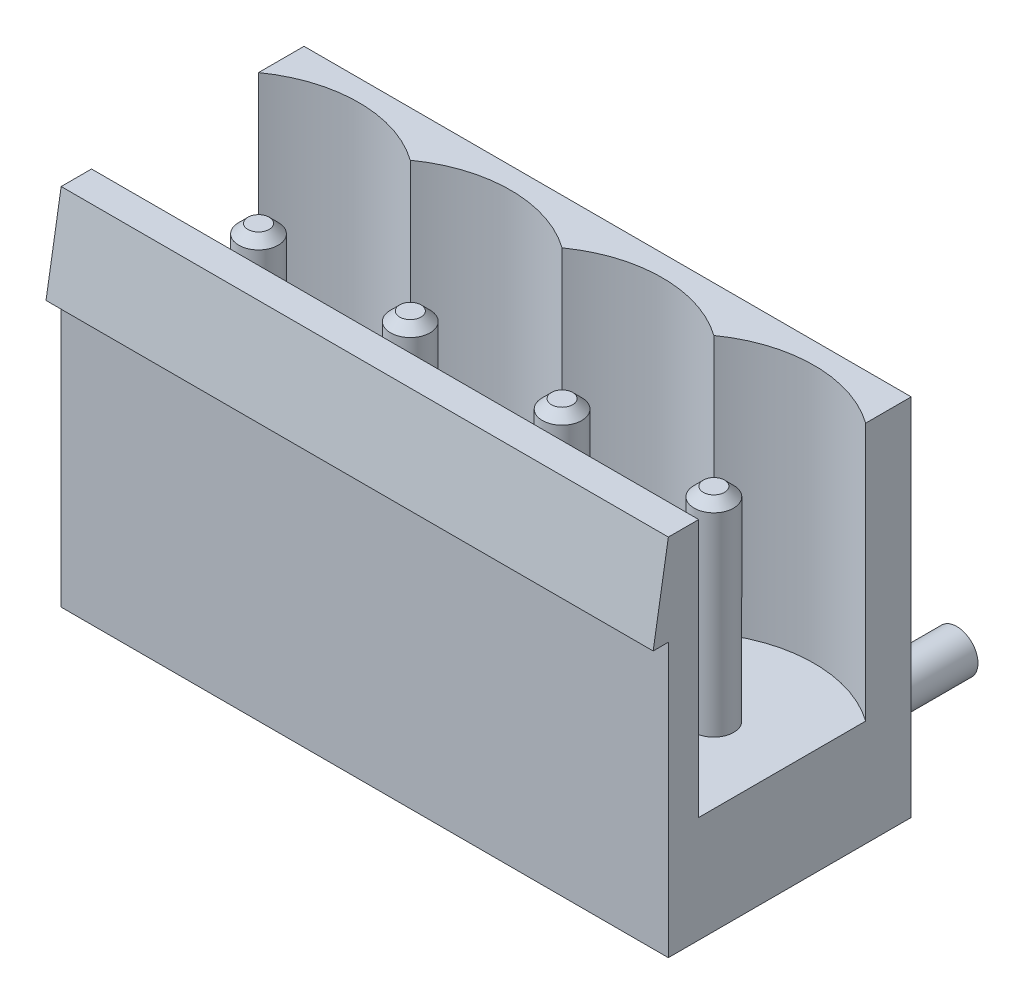
ISO-10303-21;
HEADER;
FILE_DESCRIPTION(('STEP AP214'),'2;1');
FILE_NAME('part.step','',(''),(''),'','','');
FILE_SCHEMA(('AUTOMOTIVE_DESIGN { 1 0 10303 214 1 1 1 1 }'));
ENDSEC;
DATA;
#1=APPLICATION_CONTEXT('core data for automotive mechanical design processes');
#2=APPLICATION_PROTOCOL_DEFINITION('international standard','automotive_design',2000,#1);
#3=PRODUCT_CONTEXT('',#1,'mechanical');
#4=PRODUCT('Part','Part','',(#3));
#5=PRODUCT_RELATED_PRODUCT_CATEGORY('part','',(#4));
#6=PRODUCT_DEFINITION_FORMATION('','',#4);
#7=PRODUCT_DEFINITION_CONTEXT('part definition',#1,'design');
#8=PRODUCT_DEFINITION('design','',#6,#7);
#9=PRODUCT_DEFINITION_SHAPE('','',#8);
#10=(LENGTH_UNIT() NAMED_UNIT(*) SI_UNIT(.MILLI.,.METRE.));
#11=(NAMED_UNIT(*) PLANE_ANGLE_UNIT() SI_UNIT($,.RADIAN.));
#12=(NAMED_UNIT(*) SI_UNIT($,.STERADIAN.) SOLID_ANGLE_UNIT());
#13=UNCERTAINTY_MEASURE_WITH_UNIT(LENGTH_MEASURE(1.E-05),#10,'distance_accuracy_value','');
#14=(GEOMETRIC_REPRESENTATION_CONTEXT(3) GLOBAL_UNCERTAINTY_ASSIGNED_CONTEXT((#13)) GLOBAL_UNIT_ASSIGNED_CONTEXT((#10,
#11,#12)) REPRESENTATION_CONTEXT('',''));
#15=CARTESIAN_POINT('',(0.,0.,0.));
#16=DIRECTION('',(0.,0.,1.));
#17=DIRECTION('',(1.,0.,0.));
#18=AXIS2_PLACEMENT_3D('',#15,#16,#17);
#19=CARTESIAN_POINT('',(20.,12.,0.));
#20=DIRECTION('',(0.,-1.,0.));
#21=DIRECTION('',(0.,0.,-1.));
#22=AXIS2_PLACEMENT_3D('',#19,#20,#21);
#23=PLANE('',#22);
#24=DIRECTION('',(-1.,0.,0.));
#25=VECTOR('',#24,1.);
#26=CARTESIAN_POINT('',(20.,12.,-8.));
#27=LINE('',#26,#25);
#28=CARTESIAN_POINT('',(20.,12.,-8.));
#29=VERTEX_POINT('',#28);
#30=CARTESIAN_POINT('',(0.,12.,-8.));
#31=VERTEX_POINT('',#30);
#32=EDGE_CURVE('E155',#29,#31,#27,.T.);
#33=ORIENTED_EDGE('',*,*,#32,.T.);
#34=DIRECTION('',(0.,0.,-1.));
#35=VECTOR('',#34,1.);
#36=CARTESIAN_POINT('',(0.,12.,-8.));
#37=LINE('',#36,#35);
#38=CARTESIAN_POINT('',(0.,12.,-6.5));
#39=VERTEX_POINT('',#38);
#40=EDGE_CURVE('E136',#39,#31,#37,.T.);
#41=ORIENTED_EDGE('',*,*,#40,.F.);
#42=CARTESIAN_POINT('',(2.5,12.,-2.99374999999999));
#43=DIRECTION('',(0.,1.,0.));
#44=DIRECTION('',(0.,0.,1.));
#45=AXIS2_PLACEMENT_3D('',#42,#43,#44);
#46=CIRCLE('',#45,4.30625000000001);
#47=CARTESIAN_POINT('',(5.,12.,-6.5));
#48=VERTEX_POINT('',#47);
#49=EDGE_CURVE('E213',#48,#39,#46,.T.);
#50=ORIENTED_EDGE('',*,*,#49,.F.);
#51=CARTESIAN_POINT('',(7.5,12.,-2.99374999999999));
#52=DIRECTION('',(0.,1.,0.));
#53=DIRECTION('',(0.,0.,1.));
#54=AXIS2_PLACEMENT_3D('',#51,#52,#53);
#55=CIRCLE('',#54,4.30625000000001);
#56=CARTESIAN_POINT('',(10.,12.,-6.5));
#57=VERTEX_POINT('',#56);
#58=EDGE_CURVE('E68',#57,#48,#55,.T.);
#59=ORIENTED_EDGE('',*,*,#58,.F.);
#60=CARTESIAN_POINT('',(12.5,12.,-2.99374999999999));
#61=DIRECTION('',(0.,1.,0.));
#62=DIRECTION('',(0.,0.,1.));
#63=AXIS2_PLACEMENT_3D('',#60,#61,#62);
#64=CIRCLE('',#63,4.30625000000001);
#65=CARTESIAN_POINT('',(15.,12.,-6.5));
#66=VERTEX_POINT('',#65);
#67=EDGE_CURVE('E219',#66,#57,#64,.T.);
#68=ORIENTED_EDGE('',*,*,#67,.F.);
#69=CARTESIAN_POINT('',(17.5,12.,-2.99374999999999));
#70=DIRECTION('',(0.,1.,0.));
#71=DIRECTION('',(0.,0.,1.));
#72=AXIS2_PLACEMENT_3D('',#69,#70,#71);
#73=CIRCLE('',#72,4.30625000000001);
#74=CARTESIAN_POINT('',(20.,12.,-6.5));
#75=VERTEX_POINT('',#74);
#76=EDGE_CURVE('E220',#75,#66,#73,.T.);
#77=ORIENTED_EDGE('',*,*,#76,.F.);
#78=DIRECTION('',(0.,0.,1.));
#79=VECTOR('',#78,1.);
#80=CARTESIAN_POINT('',(20.,12.,-8.));
#81=LINE('',#80,#79);
#82=EDGE_CURVE('E162',#29,#75,#81,.T.);
#83=ORIENTED_EDGE('',*,*,#82,.F.);
#84=EDGE_LOOP('',(#33,#41,#50,#59,#68,#77,#83));
#85=FACE_BOUND('',#84,.T.);
#86=ADVANCED_FACE('F32',(#85),#23,.F.);
#87=CARTESIAN_POINT('',(2.5,3.5,-2.99374999999999));
#88=DIRECTION('',(0.,1.,0.));
#89=DIRECTION('',(0.,0.,1.));
#90=AXIS2_PLACEMENT_3D('',#87,#88,#89);
#91=PLANE('',#90);
#92=CARTESIAN_POINT('',(12.5,3.5,-4.));
#93=DIRECTION('',(0.,1.,0.));
#94=DIRECTION('',(0.,0.,1.));
#95=AXIS2_PLACEMENT_3D('',#92,#93,#94);
#96=CIRCLE('',#95,0.65);
#97=CARTESIAN_POINT('',(12.5,3.5,-3.35));
#98=VERTEX_POINT('',#97);
#99=EDGE_CURVE('E276',#98,#98,#96,.T.);
#100=ORIENTED_EDGE('',*,*,#99,.F.);
#101=EDGE_LOOP('',(#100));
#102=FACE_BOUND('',#101,.T.);
#103=CARTESIAN_POINT('',(2.5,3.5,-4.));
#104=DIRECTION('',(0.,1.,0.));
#105=DIRECTION('',(0.,0.,1.));
#106=AXIS2_PLACEMENT_3D('',#103,#104,#105);
#107=CIRCLE('',#106,0.65);
#108=CARTESIAN_POINT('',(2.5,3.5,-3.35));
#109=VERTEX_POINT('',#108);
#110=EDGE_CURVE('E242',#109,#109,#107,.T.);
#111=ORIENTED_EDGE('',*,*,#110,.F.);
#112=EDGE_LOOP('',(#111));
#113=FACE_BOUND('',#112,.T.);
#114=CARTESIAN_POINT('',(2.5,3.5,-2.99374999999999));
#115=DIRECTION('',(0.,1.,0.));
#116=DIRECTION('',(0.,0.,1.));
#117=AXIS2_PLACEMENT_3D('',#114,#115,#116);
#118=CIRCLE('',#117,4.30625000000001);
#119=CARTESIAN_POINT('',(5.,3.5,-6.5));
#120=VERTEX_POINT('',#119);
#121=CARTESIAN_POINT('',(0.,3.5,-6.5));
#122=VERTEX_POINT('',#121);
#123=EDGE_CURVE('E212',#120,#122,#118,.T.);
#124=ORIENTED_EDGE('',*,*,#123,.T.);
#125=DIRECTION('',(0.,0.,1.));
#126=VECTOR('',#125,1.);
#127=CARTESIAN_POINT('',(0.,3.5,-6.5));
#128=LINE('',#127,#126);
#129=CARTESIAN_POINT('',(0.,3.5,-0.999999999999998));
#130=VERTEX_POINT('',#129);
#131=EDGE_CURVE('E247',#122,#130,#128,.T.);
#132=ORIENTED_EDGE('',*,*,#131,.T.);
#133=DIRECTION('',(1.,0.,0.));
#134=VECTOR('',#133,1.);
#135=CARTESIAN_POINT('',(0.,3.5,-0.999999999999998));
#136=LINE('',#135,#134);
#137=CARTESIAN_POINT('',(20.,3.5,-0.999999999999998));
#138=VERTEX_POINT('',#137);
#139=EDGE_CURVE('E250',#130,#138,#136,.T.);
#140=ORIENTED_EDGE('',*,*,#139,.T.);
#141=DIRECTION('',(0.,0.,-1.));
#142=VECTOR('',#141,1.);
#143=CARTESIAN_POINT('',(20.,3.5,-6.5));
#144=LINE('',#143,#142);
#145=CARTESIAN_POINT('',(20.,3.5,-6.5));
#146=VERTEX_POINT('',#145);
#147=EDGE_CURVE('E206',#138,#146,#144,.T.);
#148=ORIENTED_EDGE('',*,*,#147,.T.);
#149=CARTESIAN_POINT('',(17.5,3.5,-2.99374999999999));
#150=DIRECTION('',(0.,1.,0.));
#151=DIRECTION('',(0.,0.,1.));
#152=AXIS2_PLACEMENT_3D('',#149,#150,#151);
#153=CIRCLE('',#152,4.30625000000001);
#154=CARTESIAN_POINT('',(15.,3.5,-6.5));
#155=VERTEX_POINT('',#154);
#156=EDGE_CURVE('E273',#146,#155,#153,.T.);
#157=ORIENTED_EDGE('',*,*,#156,.T.);
#158=CARTESIAN_POINT('',(12.5,3.5,-2.99374999999999));
#159=DIRECTION('',(0.,1.,0.));
#160=DIRECTION('',(0.,0.,1.));
#161=AXIS2_PLACEMENT_3D('',#158,#159,#160);
#162=CIRCLE('',#161,4.30625000000001);
#163=CARTESIAN_POINT('',(10.,3.5,-6.5));
#164=VERTEX_POINT('',#163);
#165=EDGE_CURVE('E226',#155,#164,#162,.T.);
#166=ORIENTED_EDGE('',*,*,#165,.T.);
#167=CARTESIAN_POINT('',(7.5,3.5,-2.99374999999999));
#168=DIRECTION('',(0.,1.,0.));
#169=DIRECTION('',(0.,0.,1.));
#170=AXIS2_PLACEMENT_3D('',#167,#168,#169);
#171=CIRCLE('',#170,4.30625000000001);
#172=EDGE_CURVE('E231',#164,#120,#171,.T.);
#173=ORIENTED_EDGE('',*,*,#172,.T.);
#174=EDGE_LOOP('',(#124,#132,#140,#148,#157,#166,#173));
#175=FACE_BOUND('',#174,.T.);
#176=CARTESIAN_POINT('',(7.5,3.5,-4.));
#177=DIRECTION('',(0.,1.,0.));
#178=DIRECTION('',(0.,0.,1.));
#179=AXIS2_PLACEMENT_3D('',#176,#177,#178);
#180=CIRCLE('',#179,0.65);
#181=CARTESIAN_POINT('',(7.5,3.5,-3.35));
#182=VERTEX_POINT('',#181);
#183=EDGE_CURVE('E274',#182,#182,#180,.T.);
#184=ORIENTED_EDGE('',*,*,#183,.F.);
#185=EDGE_LOOP('',(#184));
#186=FACE_BOUND('',#185,.T.);
#187=CARTESIAN_POINT('',(17.5,3.5,-4.));
#188=DIRECTION('',(0.,1.,0.));
#189=DIRECTION('',(0.,0.,1.));
#190=AXIS2_PLACEMENT_3D('',#187,#188,#189);
#191=CIRCLE('',#190,0.65);
#192=CARTESIAN_POINT('',(17.5,3.5,-3.35));
#193=VERTEX_POINT('',#192);
#194=EDGE_CURVE('E281',#193,#193,#191,.T.);
#195=ORIENTED_EDGE('',*,*,#194,.F.);
#196=EDGE_LOOP('',(#195));
#197=FACE_BOUND('',#196,.T.);
#198=ADVANCED_FACE('F363',(#102,#113,#175,#186,#197),#91,.T.);
#199=CARTESIAN_POINT('',(20.,0.,0.));
#200=DIRECTION('',(0.,1.,0.));
#201=DIRECTION('',(0.,0.,1.));
#202=AXIS2_PLACEMENT_3D('',#199,#200,#201);
#203=PLANE('',#202);
#204=DIRECTION('',(-1.,0.,0.));
#205=VECTOR('',#204,1.);
#206=CARTESIAN_POINT('',(20.,0.,0.));
#207=LINE('',#206,#205);
#208=CARTESIAN_POINT('',(20.,0.,0.));
#209=VERTEX_POINT('',#208);
#210=CARTESIAN_POINT('',(0.,0.,0.));
#211=VERTEX_POINT('',#210);
#212=EDGE_CURVE('E309',#209,#211,#207,.T.);
#213=ORIENTED_EDGE('',*,*,#212,.T.);
#214=DIRECTION('',(0.,0.,1.));
#215=VECTOR('',#214,1.);
#216=CARTESIAN_POINT('',(0.,0.,-8.));
#217=LINE('',#216,#215);
#218=CARTESIAN_POINT('',(0.,0.,-8.));
#219=VERTEX_POINT('',#218);
#220=EDGE_CURVE('E308',#219,#211,#217,.T.);
#221=ORIENTED_EDGE('',*,*,#220,.F.);
#222=DIRECTION('',(-1.,0.,0.));
#223=VECTOR('',#222,1.);
#224=CARTESIAN_POINT('',(20.,0.,-8.));
#225=LINE('',#224,#223);
#226=CARTESIAN_POINT('',(20.,0.,-8.));
#227=VERTEX_POINT('',#226);
#228=EDGE_CURVE('E157',#227,#219,#225,.T.);
#229=ORIENTED_EDGE('',*,*,#228,.F.);
#230=DIRECTION('',(0.,0.,-1.));
#231=VECTOR('',#230,1.);
#232=CARTESIAN_POINT('',(20.,0.,-8.));
#233=LINE('',#232,#231);
#234=EDGE_CURVE('E290',#209,#227,#233,.T.);
#235=ORIENTED_EDGE('',*,*,#234,.F.);
#236=EDGE_LOOP('',(#213,#221,#229,#235));
#237=FACE_BOUND('',#236,.T.);
#238=ADVANCED_FACE('F306',(#237),#203,.F.);
#239=CARTESIAN_POINT('',(20.,0.,-8.));
#240=DIRECTION('',(0.,0.,1.));
#241=DIRECTION('',(0.,-1.,0.));
#242=AXIS2_PLACEMENT_3D('',#239,#240,#241);
#243=PLANE('',#242);
#244=CARTESIAN_POINT('',(7.5,1.5,-8.));
#245=DIRECTION('',(0.,0.,1.));
#246=DIRECTION('',(1.,0.,0.));
#247=AXIS2_PLACEMENT_3D('',#244,#245,#246);
#248=CIRCLE('',#247,0.7);
#249=CARTESIAN_POINT('',(8.2,1.5,-8.));
#250=VERTEX_POINT('',#249);
#251=EDGE_CURVE('E236',#250,#250,#248,.T.);
#252=ORIENTED_EDGE('',*,*,#251,.T.);
#253=EDGE_LOOP('',(#252));
#254=FACE_BOUND('',#253,.T.);
#255=CARTESIAN_POINT('',(2.5,1.5,-8.));
#256=DIRECTION('',(0.,0.,1.));
#257=DIRECTION('',(1.,0.,0.));
#258=AXIS2_PLACEMENT_3D('',#255,#256,#257);
#259=CIRCLE('',#258,0.7);
#260=CARTESIAN_POINT('',(3.2,1.5,-8.));
#261=VERTEX_POINT('',#260);
#262=EDGE_CURVE('E255',#261,#261,#259,.T.);
#263=ORIENTED_EDGE('',*,*,#262,.T.);
#264=EDGE_LOOP('',(#263));
#265=FACE_BOUND('',#264,.T.);
#266=ORIENTED_EDGE('',*,*,#228,.T.);
#267=DIRECTION('',(0.,1.,0.));
#268=VECTOR('',#267,1.);
#269=CARTESIAN_POINT('',(0.,-0.000999999999999265,-8.));
#270=LINE('',#269,#268);
#271=EDGE_CURVE('E139',#219,#31,#270,.T.);
#272=ORIENTED_EDGE('',*,*,#271,.T.);
#273=ORIENTED_EDGE('',*,*,#32,.F.);
#274=DIRECTION('',(0.,1.,0.));
#275=VECTOR('',#274,1.);
#276=CARTESIAN_POINT('',(20.,-0.000999999999999265,-8.));
#277=LINE('',#276,#275);
#278=EDGE_CURVE('E296',#227,#29,#277,.T.);
#279=ORIENTED_EDGE('',*,*,#278,.F.);
#280=EDGE_LOOP('',(#266,#272,#273,#279));
#281=FACE_BOUND('',#280,.T.);
#282=CARTESIAN_POINT('',(12.5,1.5,-8.));
#283=DIRECTION('',(0.,0.,1.));
#284=DIRECTION('',(1.,0.,0.));
#285=AXIS2_PLACEMENT_3D('',#282,#283,#284);
#286=CIRCLE('',#285,0.7);
#287=CARTESIAN_POINT('',(13.2,1.5,-8.));
#288=VERTEX_POINT('',#287);
#289=EDGE_CURVE('E177',#288,#288,#286,.T.);
#290=ORIENTED_EDGE('',*,*,#289,.T.);
#291=EDGE_LOOP('',(#290));
#292=FACE_BOUND('',#291,.T.);
#293=CARTESIAN_POINT('',(17.5,1.5,-8.));
#294=DIRECTION('',(0.,0.,1.));
#295=DIRECTION('',(1.,0.,0.));
#296=AXIS2_PLACEMENT_3D('',#293,#294,#295);
#297=CIRCLE('',#296,0.7);
#298=CARTESIAN_POINT('',(18.2,1.5,-8.));
#299=VERTEX_POINT('',#298);
#300=EDGE_CURVE('E183',#299,#299,#297,.T.);
#301=ORIENTED_EDGE('',*,*,#300,.T.);
#302=EDGE_LOOP('',(#301));
#303=FACE_BOUND('',#302,.T.);
#304=ADVANCED_FACE('F152',(#254,#265,#281,#292,#303),#243,.F.);
#305=DIRECTION('',(1.,0.,0.));
#306=VECTOR('',#305,1.);
#307=CARTESIAN_POINT('',(0.,12.,-0.999999999999998));
#308=LINE('',#307,#306);
#309=CARTESIAN_POINT('',(0.,12.,-0.999999999999998));
#310=VERTEX_POINT('',#309);
#311=CARTESIAN_POINT('',(20.,12.,-0.999999999999999));
#312=VERTEX_POINT('',#311);
#313=EDGE_CURVE('E209',#310,#312,#308,.T.);
#314=ORIENTED_EDGE('',*,*,#313,.F.);
#315=CARTESIAN_POINT('',(0.,12.,0.));
#316=VERTEX_POINT('',#315);
#317=EDGE_CURVE('E49',#316,#310,#37,.T.);
#318=ORIENTED_EDGE('',*,*,#317,.F.);
#319=DIRECTION('',(-1.,0.,0.));
#320=VECTOR('',#319,1.);
#321=CARTESIAN_POINT('',(20.,12.,0.));
#322=LINE('',#321,#320);
#323=CARTESIAN_POINT('',(20.,12.,0.));
#324=VERTEX_POINT('',#323);
#325=EDGE_CURVE('E163',#324,#316,#322,.T.);
#326=ORIENTED_EDGE('',*,*,#325,.F.);
#327=EDGE_CURVE('E287',#312,#324,#81,.T.);
#328=ORIENTED_EDGE('',*,*,#327,.F.);
#329=EDGE_LOOP('',(#314,#318,#326,#328));
#330=FACE_BOUND('',#329,.T.);
#331=ADVANCED_FACE('F329',(#330),#23,.F.);
#332=CARTESIAN_POINT('',(20.,9.,0.500000000000001));
#333=DIRECTION('',(0.,-0.164398987305357,-0.986393923832144));
#334=DIRECTION('',(0.,0.986393923832144,-0.164398987305357));
#335=AXIS2_PLACEMENT_3D('',#332,#333,#334);
#336=PLANE('',#335);
#337=ORIENTED_EDGE('',*,*,#325,.T.);
#338=DIRECTION('',(0.,0.986393923832144,-0.164398987305357));
#339=VECTOR('',#338,1.);
#340=CARTESIAN_POINT('',(0.,1.62064864864865,1.72989189189189));
#341=LINE('',#340,#339);
#342=CARTESIAN_POINT('',(0.,9.,0.500000000000001));
#343=VERTEX_POINT('',#342);
#344=EDGE_CURVE('E320',#343,#316,#341,.T.);
#345=ORIENTED_EDGE('',*,*,#344,.F.);
#346=DIRECTION('',(-1.,0.,0.));
#347=VECTOR('',#346,1.);
#348=CARTESIAN_POINT('',(20.,9.,0.500000000000001));
#349=LINE('',#348,#347);
#350=CARTESIAN_POINT('',(20.,9.,0.500000000000001));
#351=VERTEX_POINT('',#350);
#352=EDGE_CURVE('E168',#351,#343,#349,.T.);
#353=ORIENTED_EDGE('',*,*,#352,.F.);
#354=DIRECTION('',(0.,-0.986393923832144,0.164398987305357));
#355=VECTOR('',#354,1.);
#356=CARTESIAN_POINT('',(20.,1.62064864864865,1.72989189189189));
#357=LINE('',#356,#355);
#358=EDGE_CURVE('E311',#324,#351,#357,.T.);
#359=ORIENTED_EDGE('',*,*,#358,.F.);
#360=EDGE_LOOP('',(#337,#345,#353,#359));
#361=FACE_BOUND('',#360,.T.);
#362=ADVANCED_FACE('F332',(#361),#336,.F.);
#363=CARTESIAN_POINT('',(20.,9.,0.));
#364=DIRECTION('',(0.,1.,0.));
#365=DIRECTION('',(0.,0.,1.));
#366=AXIS2_PLACEMENT_3D('',#363,#364,#365);
#367=PLANE('',#366);
#368=ORIENTED_EDGE('',*,*,#352,.T.);
#369=DIRECTION('',(0.,0.,1.));
#370=VECTOR('',#369,1.);
#371=CARTESIAN_POINT('',(0.,9.,-8.));
#372=LINE('',#371,#370);
#373=CARTESIAN_POINT('',(0.,9.,0.));
#374=VERTEX_POINT('',#373);
#375=EDGE_CURVE('E147',#374,#343,#372,.T.);
#376=ORIENTED_EDGE('',*,*,#375,.F.);
#377=DIRECTION('',(-1.,0.,0.));
#378=VECTOR('',#377,1.);
#379=CARTESIAN_POINT('',(20.,9.,0.));
#380=LINE('',#379,#378);
#381=CARTESIAN_POINT('',(20.,9.,0.));
#382=VERTEX_POINT('',#381);
#383=EDGE_CURVE('E338',#382,#374,#380,.T.);
#384=ORIENTED_EDGE('',*,*,#383,.F.);
#385=DIRECTION('',(0.,0.,-1.));
#386=VECTOR('',#385,1.);
#387=CARTESIAN_POINT('',(20.,9.,-8.));
#388=LINE('',#387,#386);
#389=EDGE_CURVE('E286',#351,#382,#388,.T.);
#390=ORIENTED_EDGE('',*,*,#389,.F.);
#391=EDGE_LOOP('',(#368,#376,#384,#390));
#392=FACE_BOUND('',#391,.T.);
#393=ADVANCED_FACE('F336',(#392),#367,.F.);
#394=CARTESIAN_POINT('',(20.,0.,0.));
#395=DIRECTION('',(0.,0.,-1.));
#396=DIRECTION('',(0.,1.,0.));
#397=AXIS2_PLACEMENT_3D('',#394,#395,#396);
#398=PLANE('',#397);
#399=ORIENTED_EDGE('',*,*,#383,.T.);
#400=DIRECTION('',(0.,1.,0.));
#401=VECTOR('',#400,1.);
#402=CARTESIAN_POINT('',(0.,-0.00100000000000025,0.));
#403=LINE('',#402,#401);
#404=EDGE_CURVE('E158',#211,#374,#403,.T.);
#405=ORIENTED_EDGE('',*,*,#404,.F.);
#406=ORIENTED_EDGE('',*,*,#212,.F.);
#407=DIRECTION('',(0.,-1.,0.));
#408=VECTOR('',#407,1.);
#409=CARTESIAN_POINT('',(20.,-0.00100000000000025,0.));
#410=LINE('',#409,#408);
#411=EDGE_CURVE('E299',#382,#209,#410,.T.);
#412=ORIENTED_EDGE('',*,*,#411,.F.);
#413=EDGE_LOOP('',(#399,#405,#406,#412));
#414=FACE_BOUND('',#413,.T.);
#415=ADVANCED_FACE('F360',(#414),#398,.F.);
#416=CARTESIAN_POINT('',(2.5,1.5,-12.));
#417=DIRECTION('',(0.,0.,1.));
#418=DIRECTION('',(1.,0.,0.));
#419=AXIS2_PLACEMENT_3D('',#416,#417,#418);
#420=CYLINDRICAL_SURFACE('',#419,0.7);
#421=CARTESIAN_POINT('',(2.5,1.5,-12.));
#422=DIRECTION('',(0.,0.,1.));
#423=DIRECTION('',(1.,0.,0.));
#424=AXIS2_PLACEMENT_3D('',#421,#422,#423);
#425=CIRCLE('',#424,0.7);
#426=CARTESIAN_POINT('',(3.2,1.5,-12.));
#427=VERTEX_POINT('',#426);
#428=EDGE_CURVE('E259',#427,#427,#425,.T.);
#429=ORIENTED_EDGE('',*,*,#428,.T.);
#430=EDGE_LOOP('',(#429));
#431=FACE_BOUND('',#430,.T.);
#432=ORIENTED_EDGE('',*,*,#262,.F.);
#433=EDGE_LOOP('',(#432));
#434=FACE_BOUND('',#433,.T.);
#435=ADVANCED_FACE('F348',(#431,#434),#420,.T.);
#436=CARTESIAN_POINT('',(2.5,1.5,-12.));
#437=DIRECTION('',(0.,0.,1.));
#438=DIRECTION('',(1.,0.,0.));
#439=AXIS2_PLACEMENT_3D('',#436,#437,#438);
#440=PLANE('',#439);
#441=ORIENTED_EDGE('',*,*,#428,.F.);
#442=EDGE_LOOP('',(#441));
#443=FACE_BOUND('',#442,.T.);
#444=ADVANCED_FACE('F351',(#443),#440,.F.);
#445=CARTESIAN_POINT('',(2.5,3.5,-2.99374999999999));
#446=DIRECTION('',(0.,1.,0.));
#447=DIRECTION('',(0.,0.,1.));
#448=AXIS2_PLACEMENT_3D('',#445,#446,#447);
#449=CYLINDRICAL_SURFACE('',#448,4.30625000000001);
#450=ORIENTED_EDGE('',*,*,#49,.T.);
#451=DIRECTION('',(0.,1.,0.));
#452=VECTOR('',#451,1.);
#453=CARTESIAN_POINT('',(0.,3.5,-6.5));
#454=LINE('',#453,#452);
#455=EDGE_CURVE('E142',#122,#39,#454,.T.);
#456=ORIENTED_EDGE('',*,*,#455,.F.);
#457=ORIENTED_EDGE('',*,*,#123,.F.);
#458=DIRECTION('',(0.,1.,0.));
#459=VECTOR('',#458,1.);
#460=CARTESIAN_POINT('',(5.,3.5,-6.5));
#461=LINE('',#460,#459);
#462=EDGE_CURVE('E253',#120,#48,#461,.T.);
#463=ORIENTED_EDGE('',*,*,#462,.T.);
#464=EDGE_LOOP('',(#450,#456,#457,#463));
#465=FACE_BOUND('',#464,.T.);
#466=ADVANCED_FACE('F267',(#465),#449,.F.);
#467=CARTESIAN_POINT('',(0.,3.5,-0.999999999999998));
#468=DIRECTION('',(0.,0.,1.));
#469=DIRECTION('',(1.,0.,0.));
#470=AXIS2_PLACEMENT_3D('',#467,#468,#469);
#471=PLANE('',#470);
#472=ORIENTED_EDGE('',*,*,#313,.T.);
#473=DIRECTION('',(0.,1.,0.));
#474=VECTOR('',#473,1.);
#475=CARTESIAN_POINT('',(20.,3.5,-0.999999999999999));
#476=LINE('',#475,#474);
#477=EDGE_CURVE('E203',#138,#312,#476,.T.);
#478=ORIENTED_EDGE('',*,*,#477,.F.);
#479=ORIENTED_EDGE('',*,*,#139,.F.);
#480=DIRECTION('',(0.,1.,0.));
#481=VECTOR('',#480,1.);
#482=CARTESIAN_POINT('',(0.,3.5,-0.999999999999998));
#483=LINE('',#482,#481);
#484=EDGE_CURVE('E256',#130,#310,#483,.T.);
#485=ORIENTED_EDGE('',*,*,#484,.T.);
#486=EDGE_LOOP('',(#472,#478,#479,#485));
#487=FACE_BOUND('',#486,.T.);
#488=ADVANCED_FACE('F358',(#487),#471,.F.);
#489=CARTESIAN_POINT('',(2.5,13.838477631085,-4.));
#490=DIRECTION('',(0.,-1.,0.));
#491=DIRECTION('',(0.,0.,-1.));
#492=AXIS2_PLACEMENT_3D('',#489,#490,#491);
#493=CYLINDRICAL_SURFACE('',#492,0.65);
#494=CARTESIAN_POINT('',(2.5,9.90000000000001,-4.));
#495=DIRECTION('',(0.,-1.,0.));
#496=DIRECTION('',(0.,0.,-1.));
#497=AXIS2_PLACEMENT_3D('',#494,#495,#496);
#498=CIRCLE('',#497,0.65);
#499=CARTESIAN_POINT('',(2.5,9.90000000000001,-4.65));
#500=VERTEX_POINT('',#499);
#501=EDGE_CURVE('E165',#500,#500,#498,.T.);
#502=ORIENTED_EDGE('',*,*,#501,.T.);
#503=EDGE_LOOP('',(#502));
#504=FACE_BOUND('',#503,.T.);
#505=ORIENTED_EDGE('',*,*,#110,.T.);
#506=EDGE_LOOP('',(#505));
#507=FACE_BOUND('',#506,.T.);
#508=ADVANCED_FACE('F471',(#504,#507),#493,.T.);
#509=CARTESIAN_POINT('',(20.,10.2,0.));
#510=DIRECTION('',(0.,-1.,0.));
#511=DIRECTION('',(0.,0.,-1.));
#512=AXIS2_PLACEMENT_3D('',#509,#510,#511);
#513=PLANE('',#512);
#514=CARTESIAN_POINT('',(2.5,10.2,-4.));
#515=DIRECTION('',(0.,-1.,0.));
#516=DIRECTION('',(0.,0.,-1.));
#517=AXIS2_PLACEMENT_3D('',#514,#515,#516);
#518=CIRCLE('',#517,0.35);
#519=CARTESIAN_POINT('',(2.5,10.2,-4.35));
#520=VERTEX_POINT('',#519);
#521=EDGE_CURVE('E174',#520,#520,#518,.F.);
#522=ORIENTED_EDGE('',*,*,#521,.T.);
#523=EDGE_LOOP('',(#522));
#524=FACE_BOUND('',#523,.T.);
#525=ADVANCED_FACE('F387',(#524),#513,.F.);
#526=CARTESIAN_POINT('',(2.5,9.90000000000001,-4.));
#527=DIRECTION('',(0.,-1.,0.));
#528=DIRECTION('',(0.,0.,-1.));
#529=AXIS2_PLACEMENT_3D('',#526,#527,#528);
#530=CONICAL_SURFACE('',#529,0.65,0.785398163397458);
#531=ORIENTED_EDGE('',*,*,#521,.F.);
#532=EDGE_LOOP('',(#531));
#533=FACE_BOUND('',#532,.T.);
#534=ORIENTED_EDGE('',*,*,#501,.F.);
#535=EDGE_LOOP('',(#534));
#536=FACE_BOUND('',#535,.T.);
#537=ADVANCED_FACE('F383',(#533,#536),#530,.T.);
#538=CARTESIAN_POINT('',(7.5,1.5,-12.));
#539=DIRECTION('',(0.,0.,1.));
#540=DIRECTION('',(1.,0.,0.));
#541=AXIS2_PLACEMENT_3D('',#538,#539,#540);
#542=CYLINDRICAL_SURFACE('',#541,0.7);
#543=CARTESIAN_POINT('',(7.5,1.5,-12.));
#544=DIRECTION('',(0.,0.,1.));
#545=DIRECTION('',(1.,0.,0.));
#546=AXIS2_PLACEMENT_3D('',#543,#544,#545);
#547=CIRCLE('',#546,0.7);
#548=CARTESIAN_POINT('',(8.2,1.5,-12.));
#549=VERTEX_POINT('',#548);
#550=EDGE_CURVE('E239',#549,#549,#547,.T.);
#551=ORIENTED_EDGE('',*,*,#550,.T.);
#552=EDGE_LOOP('',(#551));
#553=FACE_BOUND('',#552,.T.);
#554=ORIENTED_EDGE('',*,*,#251,.F.);
#555=EDGE_LOOP('',(#554));
#556=FACE_BOUND('',#555,.T.);
#557=ADVANCED_FACE('F386',(#553,#556),#542,.T.);
#558=CARTESIAN_POINT('',(7.5,1.5,-12.));
#559=DIRECTION('',(0.,0.,1.));
#560=DIRECTION('',(1.,0.,0.));
#561=AXIS2_PLACEMENT_3D('',#558,#559,#560);
#562=PLANE('',#561);
#563=ORIENTED_EDGE('',*,*,#550,.F.);
#564=EDGE_LOOP('',(#563));
#565=FACE_BOUND('',#564,.T.);
#566=ADVANCED_FACE('F389',(#565),#562,.F.);
#567=CARTESIAN_POINT('',(12.5,1.5,-12.));
#568=DIRECTION('',(0.,0.,1.));
#569=DIRECTION('',(1.,0.,0.));
#570=AXIS2_PLACEMENT_3D('',#567,#568,#569);
#571=PLANE('',#570);
#572=CARTESIAN_POINT('',(12.5,1.5,-12.));
#573=DIRECTION('',(0.,0.,1.));
#574=DIRECTION('',(1.,0.,0.));
#575=AXIS2_PLACEMENT_3D('',#572,#573,#574);
#576=CIRCLE('',#575,0.7);
#577=CARTESIAN_POINT('',(13.2,1.5,-12.));
#578=VERTEX_POINT('',#577);
#579=EDGE_CURVE('E180',#578,#578,#576,.T.);
#580=ORIENTED_EDGE('',*,*,#579,.F.);
#581=EDGE_LOOP('',(#580));
#582=FACE_BOUND('',#581,.T.);
#583=ADVANCED_FACE('F394',(#582),#571,.F.);
#584=CARTESIAN_POINT('',(12.5,1.5,-12.));
#585=DIRECTION('',(0.,0.,1.));
#586=DIRECTION('',(1.,0.,0.));
#587=AXIS2_PLACEMENT_3D('',#584,#585,#586);
#588=CYLINDRICAL_SURFACE('',#587,0.7);
#589=ORIENTED_EDGE('',*,*,#579,.T.);
#590=EDGE_LOOP('',(#589));
#591=FACE_BOUND('',#590,.T.);
#592=ORIENTED_EDGE('',*,*,#289,.F.);
#593=EDGE_LOOP('',(#592));
#594=FACE_BOUND('',#593,.T.);
#595=ADVANCED_FACE('F390',(#591,#594),#588,.T.);
#596=CARTESIAN_POINT('',(17.5,1.5,-12.));
#597=DIRECTION('',(0.,0.,1.));
#598=DIRECTION('',(1.,0.,0.));
#599=AXIS2_PLACEMENT_3D('',#596,#597,#598);
#600=PLANE('',#599);
#601=CARTESIAN_POINT('',(17.5,1.5,-12.));
#602=DIRECTION('',(0.,0.,1.));
#603=DIRECTION('',(1.,0.,0.));
#604=AXIS2_PLACEMENT_3D('',#601,#602,#603);
#605=CIRCLE('',#604,0.7);
#606=CARTESIAN_POINT('',(18.2,1.5,-12.));
#607=VERTEX_POINT('',#606);
#608=EDGE_CURVE('E186',#607,#607,#605,.T.);
#609=ORIENTED_EDGE('',*,*,#608,.F.);
#610=EDGE_LOOP('',(#609));
#611=FACE_BOUND('',#610,.T.);
#612=ADVANCED_FACE('F393',(#611),#600,.F.);
#613=CARTESIAN_POINT('',(17.5,1.5,-12.));
#614=DIRECTION('',(0.,0.,1.));
#615=DIRECTION('',(1.,0.,0.));
#616=AXIS2_PLACEMENT_3D('',#613,#614,#615);
#617=CYLINDRICAL_SURFACE('',#616,0.7);
#618=ORIENTED_EDGE('',*,*,#608,.T.);
#619=EDGE_LOOP('',(#618));
#620=FACE_BOUND('',#619,.T.);
#621=ORIENTED_EDGE('',*,*,#300,.F.);
#622=EDGE_LOOP('',(#621));
#623=FACE_BOUND('',#622,.T.);
#624=ADVANCED_FACE('F399',(#620,#623),#617,.T.);
#625=CARTESIAN_POINT('',(7.5,3.5,-2.99374999999999));
#626=DIRECTION('',(0.,1.,0.));
#627=DIRECTION('',(0.,0.,1.));
#628=AXIS2_PLACEMENT_3D('',#625,#626,#627);
#629=CYLINDRICAL_SURFACE('',#628,4.30625000000001);
#630=ORIENTED_EDGE('',*,*,#58,.T.);
#631=ORIENTED_EDGE('',*,*,#462,.F.);
#632=ORIENTED_EDGE('',*,*,#172,.F.);
#633=DIRECTION('',(0.,1.,0.));
#634=VECTOR('',#633,1.);
#635=CARTESIAN_POINT('',(10.,3.5,-6.5));
#636=LINE('',#635,#634);
#637=EDGE_CURVE('E58',#164,#57,#636,.T.);
#638=ORIENTED_EDGE('',*,*,#637,.T.);
#639=EDGE_LOOP('',(#630,#631,#632,#638));
#640=FACE_BOUND('',#639,.T.);
#641=ADVANCED_FACE('F402',(#640),#629,.F.);
#642=CARTESIAN_POINT('',(12.5,3.5,-2.99374999999999));
#643=DIRECTION('',(0.,1.,0.));
#644=DIRECTION('',(0.,0.,1.));
#645=AXIS2_PLACEMENT_3D('',#642,#643,#644);
#646=CYLINDRICAL_SURFACE('',#645,4.30625000000001);
#647=ORIENTED_EDGE('',*,*,#67,.T.);
#648=ORIENTED_EDGE('',*,*,#637,.F.);
#649=ORIENTED_EDGE('',*,*,#165,.F.);
#650=DIRECTION('',(0.,1.,0.));
#651=VECTOR('',#650,1.);
#652=CARTESIAN_POINT('',(15.,3.5,-6.5));
#653=LINE('',#652,#651);
#654=EDGE_CURVE('E77',#155,#66,#653,.T.);
#655=ORIENTED_EDGE('',*,*,#654,.T.);
#656=EDGE_LOOP('',(#647,#648,#649,#655));
#657=FACE_BOUND('',#656,.T.);
#658=ADVANCED_FACE('F270',(#657),#646,.F.);
#659=CARTESIAN_POINT('',(17.5,3.5,-2.99374999999999));
#660=DIRECTION('',(0.,1.,0.));
#661=DIRECTION('',(0.,0.,1.));
#662=AXIS2_PLACEMENT_3D('',#659,#660,#661);
#663=CYLINDRICAL_SURFACE('',#662,4.30625000000001);
#664=ORIENTED_EDGE('',*,*,#76,.T.);
#665=ORIENTED_EDGE('',*,*,#654,.F.);
#666=ORIENTED_EDGE('',*,*,#156,.F.);
#667=DIRECTION('',(0.,1.,0.));
#668=VECTOR('',#667,1.);
#669=CARTESIAN_POINT('',(20.,3.5,-6.5));
#670=LINE('',#669,#668);
#671=EDGE_CURVE('E205',#146,#75,#670,.T.);
#672=ORIENTED_EDGE('',*,*,#671,.T.);
#673=EDGE_LOOP('',(#664,#665,#666,#672));
#674=FACE_BOUND('',#673,.T.);
#675=ADVANCED_FACE('F272',(#674),#663,.F.);
#676=CARTESIAN_POINT('',(7.5,13.838477631085,-4.));
#677=DIRECTION('',(0.,-1.,0.));
#678=DIRECTION('',(0.,0.,-1.));
#679=AXIS2_PLACEMENT_3D('',#676,#677,#678);
#680=CYLINDRICAL_SURFACE('',#679,0.65);
#681=CARTESIAN_POINT('',(7.5,9.90000000000001,-4.));
#682=DIRECTION('',(0.,-1.,0.));
#683=DIRECTION('',(0.,0.,-1.));
#684=AXIS2_PLACEMENT_3D('',#681,#682,#683);
#685=CIRCLE('',#684,0.65);
#686=CARTESIAN_POINT('',(7.5,9.90000000000001,-4.65));
#687=VERTEX_POINT('',#686);
#688=EDGE_CURVE('E189',#687,#687,#685,.T.);
#689=ORIENTED_EDGE('',*,*,#688,.T.);
#690=EDGE_LOOP('',(#689));
#691=FACE_BOUND('',#690,.T.);
#692=ORIENTED_EDGE('',*,*,#183,.T.);
#693=EDGE_LOOP('',(#692));
#694=FACE_BOUND('',#693,.T.);
#695=ADVANCED_FACE('F452',(#691,#694),#680,.T.);
#696=CARTESIAN_POINT('',(20.,10.2,0.));
#697=DIRECTION('',(0.,-1.,0.));
#698=DIRECTION('',(0.,0.,-1.));
#699=AXIS2_PLACEMENT_3D('',#696,#697,#698);
#700=PLANE('',#699);
#701=CARTESIAN_POINT('',(7.5,10.2,-4.));
#702=DIRECTION('',(0.,-1.,0.));
#703=DIRECTION('',(0.,0.,-1.));
#704=AXIS2_PLACEMENT_3D('',#701,#702,#703);
#705=CIRCLE('',#704,0.35);
#706=CARTESIAN_POINT('',(7.5,10.2,-4.35));
#707=VERTEX_POINT('',#706);
#708=EDGE_CURVE('E192',#707,#707,#705,.F.);
#709=ORIENTED_EDGE('',*,*,#708,.T.);
#710=EDGE_LOOP('',(#709));
#711=FACE_BOUND('',#710,.T.);
#712=ADVANCED_FACE('F426',(#711),#700,.F.);
#713=CARTESIAN_POINT('',(12.5,13.838477631085,-4.));
#714=DIRECTION('',(0.,-1.,0.));
#715=DIRECTION('',(0.,0.,-1.));
#716=AXIS2_PLACEMENT_3D('',#713,#714,#715);
#717=CYLINDRICAL_SURFACE('',#716,0.65);
#718=CARTESIAN_POINT('',(12.5,9.90000000000001,-4.));
#719=DIRECTION('',(0.,-1.,0.));
#720=DIRECTION('',(0.,0.,-1.));
#721=AXIS2_PLACEMENT_3D('',#718,#719,#720);
#722=CIRCLE('',#721,0.65);
#723=CARTESIAN_POINT('',(12.5,9.90000000000001,-4.65));
#724=VERTEX_POINT('',#723);
#725=EDGE_CURVE('E195',#724,#724,#722,.T.);
#726=ORIENTED_EDGE('',*,*,#725,.T.);
#727=EDGE_LOOP('',(#726));
#728=FACE_BOUND('',#727,.T.);
#729=ORIENTED_EDGE('',*,*,#99,.T.);
#730=EDGE_LOOP('',(#729));
#731=FACE_BOUND('',#730,.T.);
#732=ADVANCED_FACE('F422',(#728,#731),#717,.T.);
#733=CARTESIAN_POINT('',(20.,10.2,0.));
#734=DIRECTION('',(0.,-1.,0.));
#735=DIRECTION('',(0.,0.,-1.));
#736=AXIS2_PLACEMENT_3D('',#733,#734,#735);
#737=PLANE('',#736);
#738=CARTESIAN_POINT('',(12.5,10.2,-4.));
#739=DIRECTION('',(0.,-1.,0.));
#740=DIRECTION('',(0.,0.,-1.));
#741=AXIS2_PLACEMENT_3D('',#738,#739,#740);
#742=CIRCLE('',#741,0.350000000000003);
#743=CARTESIAN_POINT('',(12.5,10.2,-4.35));
#744=VERTEX_POINT('',#743);
#745=EDGE_CURVE('E198',#744,#744,#742,.F.);
#746=ORIENTED_EDGE('',*,*,#745,.T.);
#747=EDGE_LOOP('',(#746));
#748=FACE_BOUND('',#747,.T.);
#749=ADVANCED_FACE('F425',(#748),#737,.F.);
#750=CARTESIAN_POINT('',(17.5,13.838477631085,-4.));
#751=DIRECTION('',(0.,-1.,0.));
#752=DIRECTION('',(0.,0.,-1.));
#753=AXIS2_PLACEMENT_3D('',#750,#751,#752);
#754=CYLINDRICAL_SURFACE('',#753,0.65);
#755=CARTESIAN_POINT('',(17.5,9.9,-4.));
#756=DIRECTION('',(0.,-1.,0.));
#757=DIRECTION('',(0.,0.,-1.));
#758=AXIS2_PLACEMENT_3D('',#755,#756,#757);
#759=CIRCLE('',#758,0.65);
#760=CARTESIAN_POINT('',(17.5,9.9,-4.65));
#761=VERTEX_POINT('',#760);
#762=EDGE_CURVE('E41',#761,#761,#759,.T.);
#763=ORIENTED_EDGE('',*,*,#762,.T.);
#764=EDGE_LOOP('',(#763));
#765=FACE_BOUND('',#764,.T.);
#766=ORIENTED_EDGE('',*,*,#194,.T.);
#767=EDGE_LOOP('',(#766));
#768=FACE_BOUND('',#767,.T.);
#769=ADVANCED_FACE('F436',(#765,#768),#754,.T.);
#770=CARTESIAN_POINT('',(20.,10.2,0.));
#771=DIRECTION('',(0.,-1.,0.));
#772=DIRECTION('',(0.,0.,-1.));
#773=AXIS2_PLACEMENT_3D('',#770,#771,#772);
#774=PLANE('',#773);
#775=CARTESIAN_POINT('',(17.5,10.2,-4.));
#776=DIRECTION('',(0.,-1.,0.));
#777=DIRECTION('',(0.,0.,-1.));
#778=AXIS2_PLACEMENT_3D('',#775,#776,#777);
#779=CIRCLE('',#778,0.349999999999996);
#780=CARTESIAN_POINT('',(17.5,10.2,-4.34999999999999));
#781=VERTEX_POINT('',#780);
#782=EDGE_CURVE('E12',#781,#781,#779,.F.);
#783=ORIENTED_EDGE('',*,*,#782,.T.);
#784=EDGE_LOOP('',(#783));
#785=FACE_BOUND('',#784,.T.);
#786=ADVANCED_FACE('F410',(#785),#774,.F.);
#787=CARTESIAN_POINT('',(7.5,9.90000000000001,-4.));
#788=DIRECTION('',(0.,-1.,0.));
#789=DIRECTION('',(0.,0.,-1.));
#790=AXIS2_PLACEMENT_3D('',#787,#788,#789);
#791=CONICAL_SURFACE('',#790,0.65,0.785398163397458);
#792=ORIENTED_EDGE('',*,*,#708,.F.);
#793=EDGE_LOOP('',(#792));
#794=FACE_BOUND('',#793,.T.);
#795=ORIENTED_EDGE('',*,*,#688,.F.);
#796=EDGE_LOOP('',(#795));
#797=FACE_BOUND('',#796,.T.);
#798=ADVANCED_FACE('F407',(#794,#797),#791,.T.);
#799=CARTESIAN_POINT('',(12.5,9.90000000000001,-4.));
#800=DIRECTION('',(0.,-1.,0.));
#801=DIRECTION('',(0.,0.,-1.));
#802=AXIS2_PLACEMENT_3D('',#799,#800,#801);
#803=CONICAL_SURFACE('',#802,0.65,0.785398163397452);
#804=ORIENTED_EDGE('',*,*,#745,.F.);
#805=EDGE_LOOP('',(#804));
#806=FACE_BOUND('',#805,.T.);
#807=ORIENTED_EDGE('',*,*,#725,.F.);
#808=EDGE_LOOP('',(#807));
#809=FACE_BOUND('',#808,.T.);
#810=ADVANCED_FACE('F409',(#806,#809),#803,.T.);
#811=CARTESIAN_POINT('',(17.5,9.9,-4.));
#812=DIRECTION('',(0.,-1.,0.));
#813=DIRECTION('',(0.,0.,-1.));
#814=AXIS2_PLACEMENT_3D('',#811,#812,#813);
#815=CONICAL_SURFACE('',#814,0.65,0.785398163397458);
#816=ORIENTED_EDGE('',*,*,#782,.F.);
#817=EDGE_LOOP('',(#816));
#818=FACE_BOUND('',#817,.T.);
#819=ORIENTED_EDGE('',*,*,#762,.F.);
#820=EDGE_LOOP('',(#819));
#821=FACE_BOUND('',#820,.T.);
#822=ADVANCED_FACE('F34',(#818,#821),#815,.T.);
#823=CARTESIAN_POINT('',(20.,-0.000999999999999265,-8.));
#824=DIRECTION('',(-1.,0.,0.));
#825=DIRECTION('',(0.,0.,1.));
#826=AXIS2_PLACEMENT_3D('',#823,#824,#825);
#827=PLANE('',#826);
#828=ORIENTED_EDGE('',*,*,#327,.T.);
#829=ORIENTED_EDGE('',*,*,#358,.T.);
#830=ORIENTED_EDGE('',*,*,#389,.T.);
#831=ORIENTED_EDGE('',*,*,#411,.T.);
#832=ORIENTED_EDGE('',*,*,#234,.T.);
#833=ORIENTED_EDGE('',*,*,#278,.T.);
#834=ORIENTED_EDGE('',*,*,#82,.T.);
#835=ORIENTED_EDGE('',*,*,#671,.F.);
#836=ORIENTED_EDGE('',*,*,#147,.F.);
#837=ORIENTED_EDGE('',*,*,#477,.T.);
#838=EDGE_LOOP('',(#828,#829,#830,#831,#832,#833,#834,#835,#836,#837));
#839=FACE_BOUND('',#838,.T.);
#840=ADVANCED_FACE('F303',(#839),#827,.F.);
#841=CARTESIAN_POINT('',(0.,-0.000999999999999265,-8.));
#842=DIRECTION('',(1.,0.,0.));
#843=DIRECTION('',(0.,0.,-1.));
#844=AXIS2_PLACEMENT_3D('',#841,#842,#843);
#845=PLANE('',#844);
#846=ORIENTED_EDGE('',*,*,#40,.T.);
#847=ORIENTED_EDGE('',*,*,#271,.F.);
#848=ORIENTED_EDGE('',*,*,#220,.T.);
#849=ORIENTED_EDGE('',*,*,#404,.T.);
#850=ORIENTED_EDGE('',*,*,#375,.T.);
#851=ORIENTED_EDGE('',*,*,#344,.T.);
#852=ORIENTED_EDGE('',*,*,#317,.T.);
#853=ORIENTED_EDGE('',*,*,#484,.F.);
#854=ORIENTED_EDGE('',*,*,#131,.F.);
#855=ORIENTED_EDGE('',*,*,#455,.T.);
#856=EDGE_LOOP('',(#846,#847,#848,#849,#850,#851,#852,#853,#854,#855));
#857=FACE_BOUND('',#856,.T.);
#858=ADVANCED_FACE('F138',(#857),#845,.F.);
#859=CLOSED_SHELL('',(#86,#198,#238,#304,#331,#362,#393,#415,#435,#444,#466,#488,#508,#525,#537,
#557,#566,#583,#595,#612,#624,#641,#658,#675,#695,#712,#732,#749,#769,#786,#798,#810,#822,#840,#858));
#860=MANIFOLD_SOLID_BREP('B2',#859);
#861=ADVANCED_BREP_SHAPE_REPRESENTATION('',(#18,#860),#14);
#862=SHAPE_DEFINITION_REPRESENTATION(#9,#861);
ENDSEC;
END-ISO-10303-21;
